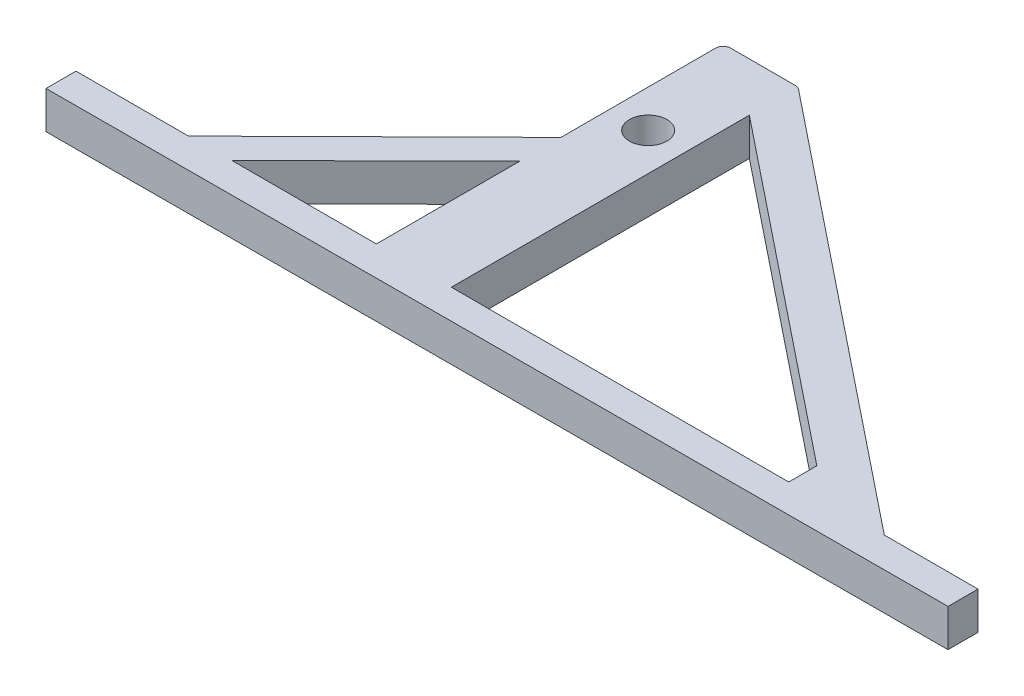
ISO-10303-21;
HEADER;
FILE_DESCRIPTION(('STEP AP214'),'2;1');
FILE_NAME('part.step','',(''),(''),'','','');
FILE_SCHEMA(('AUTOMOTIVE_DESIGN { 1 0 10303 214 1 1 1 1 }'));
ENDSEC;
DATA;
#1=APPLICATION_CONTEXT('core data for automotive mechanical design processes');
#2=APPLICATION_PROTOCOL_DEFINITION('international standard','automotive_design',2000,#1);
#3=PRODUCT_CONTEXT('',#1,'mechanical');
#4=PRODUCT('Part','Part','',(#3));
#5=PRODUCT_RELATED_PRODUCT_CATEGORY('part','',(#4));
#6=PRODUCT_DEFINITION_FORMATION('','',#4);
#7=PRODUCT_DEFINITION_CONTEXT('part definition',#1,'design');
#8=PRODUCT_DEFINITION('design','',#6,#7);
#9=PRODUCT_DEFINITION_SHAPE('','',#8);
#10=(LENGTH_UNIT() NAMED_UNIT(*) SI_UNIT(.MILLI.,.METRE.));
#11=(NAMED_UNIT(*) PLANE_ANGLE_UNIT() SI_UNIT($,.RADIAN.));
#12=(NAMED_UNIT(*) SI_UNIT($,.STERADIAN.) SOLID_ANGLE_UNIT());
#13=UNCERTAINTY_MEASURE_WITH_UNIT(LENGTH_MEASURE(1.E-05),#10,'distance_accuracy_value','');
#14=(GEOMETRIC_REPRESENTATION_CONTEXT(3) GLOBAL_UNCERTAINTY_ASSIGNED_CONTEXT((#13)) GLOBAL_UNIT_ASSIGNED_CONTEXT((#10,
#11,#12)) REPRESENTATION_CONTEXT('',''));
#15=CARTESIAN_POINT('',(0.,0.,0.));
#16=DIRECTION('',(0.,0.,1.));
#17=DIRECTION('',(1.,0.,0.));
#18=AXIS2_PLACEMENT_3D('',#15,#16,#17);
#19=CARTESIAN_POINT('',(24.5090161092301,12.7,-124.46));
#20=DIRECTION('',(0.,1.,0.));
#21=DIRECTION('',(0.,0.,1.));
#22=AXIS2_PLACEMENT_3D('',#19,#20,#21);
#23=PLANE('',#22);
#24=CARTESIAN_POINT('',(24.5090161092301,12.7,-124.46));
#25=DIRECTION('',(0.,1.,0.));
#26=DIRECTION('',(0.,0.,1.));
#27=AXIS2_PLACEMENT_3D('',#24,#25,#26);
#28=CIRCLE('',#27,2.54);
#29=CARTESIAN_POINT('',(26.0957415300184,12.7,-126.443406775985));
#30=VERTEX_POINT('',#29);
#31=CARTESIAN_POINT('',(24.5090161092301,12.7,-127.));
#32=VERTEX_POINT('',#31);
#33=EDGE_CURVE('E233',#30,#32,#28,.T.);
#34=ORIENTED_EDGE('',*,*,#33,.T.);
#35=DIRECTION('',(-1.,0.,0.));
#36=VECTOR('',#35,1.);
#37=CARTESIAN_POINT('',(2.54000000000002,12.7,-127.));
#38=LINE('',#37,#36);
#39=CARTESIAN_POINT('',(2.54,12.7,-127.));
#40=VERTEX_POINT('',#39);
#41=EDGE_CURVE('E236',#32,#40,#38,.T.);
#42=ORIENTED_EDGE('',*,*,#41,.T.);
#43=CARTESIAN_POINT('',(2.54,12.7,-124.46));
#44=DIRECTION('',(0.,1.,0.));
#45=DIRECTION('',(0.,0.,-1.));
#46=AXIS2_PLACEMENT_3D('',#43,#44,#45);
#47=CIRCLE('',#46,2.54);
#48=CARTESIAN_POINT('',(0.,12.7,-124.46));
#49=VERTEX_POINT('',#48);
#50=EDGE_CURVE('E239',#40,#49,#47,.T.);
#51=ORIENTED_EDGE('',*,*,#50,.T.);
#52=DIRECTION('',(0.,0.,1.));
#53=VECTOR('',#52,1.);
#54=CARTESIAN_POINT('',(0.,12.7,-72.0550274791085));
#55=LINE('',#54,#53);
#56=CARTESIAN_POINT('',(0.,12.7,-72.0550274791085));
#57=VERTEX_POINT('',#56);
#58=EDGE_CURVE('E241',#49,#57,#55,.T.);
#59=ORIENTED_EDGE('',*,*,#58,.T.);
#60=DIRECTION('',(-0.711451027338555,0.,0.702735679824865));
#61=VECTOR('',#60,1.);
#62=CARTESIAN_POINT('',(-63.5,12.7,-9.33290894368325));
#63=LINE('',#62,#61);
#64=CARTESIAN_POINT('',(-63.5,12.7,-9.33290894368325));
#65=VERTEX_POINT('',#64);
#66=EDGE_CURVE('E243',#57,#65,#63,.T.);
#67=ORIENTED_EDGE('',*,*,#66,.T.);
#68=DIRECTION('',(-1.,0.,0.));
#69=VECTOR('',#68,1.);
#70=CARTESIAN_POINT('',(-63.5,12.7,-9.33290894368325));
#71=LINE('',#70,#69);
#72=CARTESIAN_POINT('',(-101.6,12.7,-9.33290894368324));
#73=VERTEX_POINT('',#72);
#74=EDGE_CURVE('E245',#65,#73,#71,.T.);
#75=ORIENTED_EDGE('',*,*,#74,.T.);
#76=DIRECTION('',(0.,0.,1.));
#77=VECTOR('',#76,1.);
#78=CARTESIAN_POINT('',(-101.6,12.7,-9.33290894368324));
#79=LINE('',#78,#77);
#80=CARTESIAN_POINT('',(-101.6,12.7,0.827091056316761));
#81=VERTEX_POINT('',#80);
#82=EDGE_CURVE('E247',#73,#81,#79,.T.);
#83=ORIENTED_EDGE('',*,*,#82,.T.);
#84=DIRECTION('',(0.999996318334483,0.,-0.00271354334397683));
#85=VECTOR('',#84,1.);
#86=CARTESIAN_POINT('',(-101.6,12.7,0.827091056316761));
#87=LINE('',#86,#85);
#88=CARTESIAN_POINT('',(203.2,12.7,0.));
#89=VERTEX_POINT('',#88);
#90=EDGE_CURVE('E249',#81,#89,#87,.T.);
#91=ORIENTED_EDGE('',*,*,#90,.T.);
#92=DIRECTION('',(0.,0.,-1.));
#93=VECTOR('',#92,1.);
#94=CARTESIAN_POINT('',(203.2,12.7,0.));
#95=LINE('',#94,#93);
#96=CARTESIAN_POINT('',(203.2,12.7,-10.16));
#97=VERTEX_POINT('',#96);
#98=EDGE_CURVE('E251',#89,#97,#95,.T.);
#99=ORIENTED_EDGE('',*,*,#98,.T.);
#100=DIRECTION('',(-1.,0.,0.));
#101=VECTOR('',#100,1.);
#102=CARTESIAN_POINT('',(203.2,12.7,-10.16));
#103=LINE('',#102,#101);
#104=CARTESIAN_POINT('',(171.45,12.7,-10.16));
#105=VERTEX_POINT('',#104);
#106=EDGE_CURVE('E253',#97,#105,#103,.T.);
#107=ORIENTED_EDGE('',*,*,#106,.T.);
#108=DIRECTION('',(-0.78086880944303,0.,-0.624695047554424));
#109=VECTOR('',#108,1.);
#110=CARTESIAN_POINT('',(171.45,12.7,-10.16));
#111=LINE('',#110,#109);
#112=EDGE_CURVE('E255',#105,#30,#111,.T.);
#113=ORIENTED_EDGE('',*,*,#112,.T.);
#114=EDGE_LOOP('',(#34,#42,#51,#59,#67,#75,#83,#91,#99,#107,#113));
#115=FACE_BOUND('',#114,.T.);
#116=CARTESIAN_POINT('',(12.7,12.7,-88.9));
#117=DIRECTION('',(0.,1.,0.));
#118=DIRECTION('',(0.,0.,1.));
#119=AXIS2_PLACEMENT_3D('',#116,#117,#118);
#120=CIRCLE('',#119,6.35);
#121=CARTESIAN_POINT('',(12.7,12.7,-95.25));
#122=VERTEX_POINT('',#121);
#123=EDGE_CURVE('E227',#122,#122,#120,.T.);
#124=ORIENTED_EDGE('',*,*,#123,.F.);
#125=EDGE_LOOP('',(#124));
#126=FACE_BOUND('',#125,.T.);
#127=DIRECTION('',(0.,0.,-1.));
#128=VECTOR('',#127,1.);
#129=CARTESIAN_POINT('',(0.,12.7,-9.52499999999999));
#130=LINE('',#129,#128);
#131=CARTESIAN_POINT('',(0.,12.7,-9.52499999999999));
#132=VERTEX_POINT('',#131);
#133=CARTESIAN_POINT('',(0.,12.7,-58.0850274791085));
#134=VERTEX_POINT('',#133);
#135=EDGE_CURVE('E205',#132,#134,#130,.T.);
#136=ORIENTED_EDGE('',*,*,#135,.F.);
#137=DIRECTION('',(1.,0.,0.));
#138=VECTOR('',#137,1.);
#139=CARTESIAN_POINT('',(0.,12.7,-9.52499999999999));
#140=LINE('',#139,#138);
#141=CARTESIAN_POINT('',(-48.9620011163881,12.7,-9.52499999999999));
#142=VERTEX_POINT('',#141);
#143=EDGE_CURVE('E203',#142,#132,#140,.T.);
#144=ORIENTED_EDGE('',*,*,#143,.F.);
#145=DIRECTION('',(-0.710015355632729,0.,0.70418619325128));
#146=VECTOR('',#145,1.);
#147=CARTESIAN_POINT('',(-48.9620011163881,12.7,-9.52499999999999));
#148=LINE('',#147,#146);
#149=EDGE_CURVE('E209',#134,#142,#148,.T.);
#150=ORIENTED_EDGE('',*,*,#149,.F.);
#151=EDGE_LOOP('',(#136,#144,#150));
#152=FACE_BOUND('',#151,.T.);
#153=DIRECTION('',(0.,0.,1.));
#154=VECTOR('',#153,1.);
#155=CARTESIAN_POINT('',(25.4,12.7,-9.52499999999999));
#156=LINE('',#155,#154);
#157=CARTESIAN_POINT('',(25.4,12.7,-110.49));
#158=VERTEX_POINT('',#157);
#159=CARTESIAN_POINT('',(25.4,12.7,-9.52499999999999));
#160=VERTEX_POINT('',#159);
#161=EDGE_CURVE('E175',#158,#160,#156,.T.);
#162=ORIENTED_EDGE('',*,*,#161,.F.);
#163=DIRECTION('',(-0.78086880944303,0.,-0.624695047554424));
#164=VECTOR('',#163,1.);
#165=CARTESIAN_POINT('',(139.7,12.7,-19.05));
#166=LINE('',#165,#164);
#167=CARTESIAN_POINT('',(139.7,12.7,-19.05));
#168=VERTEX_POINT('',#167);
#169=EDGE_CURVE('E167',#168,#158,#166,.T.);
#170=ORIENTED_EDGE('',*,*,#169,.F.);
#171=DIRECTION('',(0.,0.,-1.));
#172=VECTOR('',#171,1.);
#173=CARTESIAN_POINT('',(139.7,12.7,-9.525));
#174=LINE('',#173,#172);
#175=CARTESIAN_POINT('',(139.7,12.7,-9.52499999999999));
#176=VERTEX_POINT('',#175);
#177=EDGE_CURVE('E189',#176,#168,#174,.T.);
#178=ORIENTED_EDGE('',*,*,#177,.F.);
#179=DIRECTION('',(1.,0.,0.));
#180=VECTOR('',#179,1.);
#181=CARTESIAN_POINT('',(139.7,12.7,-9.525));
#182=LINE('',#181,#180);
#183=EDGE_CURVE('E187',#160,#176,#182,.T.);
#184=ORIENTED_EDGE('',*,*,#183,.F.);
#185=EDGE_LOOP('',(#162,#170,#178,#184));
#186=FACE_BOUND('',#185,.T.);
#187=ADVANCED_FACE('F42',(#115,#126,#152,#186),#23,.T.);
#188=CARTESIAN_POINT('',(24.5090161092301,0.,-124.46));
#189=DIRECTION('',(0.,1.,0.));
#190=DIRECTION('',(0.,0.,1.));
#191=AXIS2_PLACEMENT_3D('',#188,#189,#190);
#192=PLANE('',#191);
#193=DIRECTION('',(1.,0.,0.));
#194=VECTOR('',#193,1.);
#195=CARTESIAN_POINT('',(0.,0.,-9.52499999999999));
#196=LINE('',#195,#194);
#197=CARTESIAN_POINT('',(-48.9620011163881,0.,-9.52499999999998));
#198=VERTEX_POINT('',#197);
#199=CARTESIAN_POINT('',(0.,0.,-9.52499999999999));
#200=VERTEX_POINT('',#199);
#201=EDGE_CURVE('E183',#198,#200,#196,.T.);
#202=ORIENTED_EDGE('',*,*,#201,.T.);
#203=DIRECTION('',(0.,0.,-1.));
#204=VECTOR('',#203,1.);
#205=CARTESIAN_POINT('',(0.,0.,-9.52499999999999));
#206=LINE('',#205,#204);
#207=CARTESIAN_POINT('',(0.,0.,-58.0850274791085));
#208=VERTEX_POINT('',#207);
#209=EDGE_CURVE('E214',#200,#208,#206,.T.);
#210=ORIENTED_EDGE('',*,*,#209,.T.);
#211=DIRECTION('',(-0.710015355632729,0.,0.70418619325128));
#212=VECTOR('',#211,1.);
#213=CARTESIAN_POINT('',(-48.9620011163881,0.,-9.52499999999999));
#214=LINE('',#213,#212);
#215=EDGE_CURVE('E206',#208,#198,#214,.T.);
#216=ORIENTED_EDGE('',*,*,#215,.T.);
#217=EDGE_LOOP('',(#202,#210,#216));
#218=FACE_BOUND('',#217,.T.);
#219=CARTESIAN_POINT('',(24.5090161092301,0.,-124.46));
#220=DIRECTION('',(0.,1.,0.));
#221=DIRECTION('',(0.,0.,1.));
#222=AXIS2_PLACEMENT_3D('',#219,#220,#221);
#223=CIRCLE('',#222,2.54);
#224=CARTESIAN_POINT('',(26.0957415300184,0.,-126.443406775985));
#225=VERTEX_POINT('',#224);
#226=CARTESIAN_POINT('',(24.5090161092301,0.,-127.));
#227=VERTEX_POINT('',#226);
#228=EDGE_CURVE('E230',#225,#227,#223,.T.);
#229=ORIENTED_EDGE('',*,*,#228,.F.);
#230=DIRECTION('',(-0.78086880944303,0.,-0.624695047554424));
#231=VECTOR('',#230,1.);
#232=CARTESIAN_POINT('',(171.45,0.,-10.16));
#233=LINE('',#232,#231);
#234=CARTESIAN_POINT('',(171.45,0.,-10.16));
#235=VERTEX_POINT('',#234);
#236=EDGE_CURVE('E237',#235,#225,#233,.T.);
#237=ORIENTED_EDGE('',*,*,#236,.F.);
#238=DIRECTION('',(-1.,0.,0.));
#239=VECTOR('',#238,1.);
#240=CARTESIAN_POINT('',(203.2,0.,-10.16));
#241=LINE('',#240,#239);
#242=CARTESIAN_POINT('',(203.2,0.,-10.16));
#243=VERTEX_POINT('',#242);
#244=EDGE_CURVE('E276',#243,#235,#241,.T.);
#245=ORIENTED_EDGE('',*,*,#244,.F.);
#246=DIRECTION('',(0.,0.,-1.));
#247=VECTOR('',#246,1.);
#248=CARTESIAN_POINT('',(203.2,0.,0.));
#249=LINE('',#248,#247);
#250=CARTESIAN_POINT('',(203.2,0.,0.));
#251=VERTEX_POINT('',#250);
#252=EDGE_CURVE('E274',#251,#243,#249,.T.);
#253=ORIENTED_EDGE('',*,*,#252,.F.);
#254=DIRECTION('',(0.999996318334483,0.,-0.00271354334397683));
#255=VECTOR('',#254,1.);
#256=CARTESIAN_POINT('',(-101.6,0.,0.827091056316761));
#257=LINE('',#256,#255);
#258=CARTESIAN_POINT('',(-101.6,0.,0.827091056316761));
#259=VERTEX_POINT('',#258);
#260=EDGE_CURVE('E272',#259,#251,#257,.T.);
#261=ORIENTED_EDGE('',*,*,#260,.F.);
#262=DIRECTION('',(0.,0.,1.));
#263=VECTOR('',#262,1.);
#264=CARTESIAN_POINT('',(-101.6,0.,-9.33290894368324));
#265=LINE('',#264,#263);
#266=CARTESIAN_POINT('',(-101.6,0.,-9.33290894368324));
#267=VERTEX_POINT('',#266);
#268=EDGE_CURVE('E270',#267,#259,#265,.T.);
#269=ORIENTED_EDGE('',*,*,#268,.F.);
#270=DIRECTION('',(-1.,0.,0.));
#271=VECTOR('',#270,1.);
#272=CARTESIAN_POINT('',(-63.5,0.,-9.33290894368325));
#273=LINE('',#272,#271);
#274=CARTESIAN_POINT('',(-63.5,0.,-9.33290894368325));
#275=VERTEX_POINT('',#274);
#276=EDGE_CURVE('E268',#275,#267,#273,.T.);
#277=ORIENTED_EDGE('',*,*,#276,.F.);
#278=DIRECTION('',(-0.711451027338555,0.,0.702735679824865));
#279=VECTOR('',#278,1.);
#280=CARTESIAN_POINT('',(-63.5,0.,-9.33290894368325));
#281=LINE('',#280,#279);
#282=CARTESIAN_POINT('',(0.,0.,-72.0550274791085));
#283=VERTEX_POINT('',#282);
#284=EDGE_CURVE('E266',#283,#275,#281,.T.);
#285=ORIENTED_EDGE('',*,*,#284,.F.);
#286=DIRECTION('',(0.,0.,1.));
#287=VECTOR('',#286,1.);
#288=CARTESIAN_POINT('',(0.,0.,-72.0550274791085));
#289=LINE('',#288,#287);
#290=CARTESIAN_POINT('',(0.,0.,-124.46));
#291=VERTEX_POINT('',#290);
#292=EDGE_CURVE('E264',#291,#283,#289,.T.);
#293=ORIENTED_EDGE('',*,*,#292,.F.);
#294=CARTESIAN_POINT('',(2.54,0.,-124.46));
#295=DIRECTION('',(0.,1.,0.));
#296=DIRECTION('',(0.,0.,-1.));
#297=AXIS2_PLACEMENT_3D('',#294,#295,#296);
#298=CIRCLE('',#297,2.54);
#299=CARTESIAN_POINT('',(2.54,0.,-127.));
#300=VERTEX_POINT('',#299);
#301=EDGE_CURVE('E262',#300,#291,#298,.T.);
#302=ORIENTED_EDGE('',*,*,#301,.F.);
#303=DIRECTION('',(-1.,0.,0.));
#304=VECTOR('',#303,1.);
#305=CARTESIAN_POINT('',(2.54000000000002,0.,-127.));
#306=LINE('',#305,#304);
#307=EDGE_CURVE('E260',#227,#300,#306,.T.);
#308=ORIENTED_EDGE('',*,*,#307,.F.);
#309=EDGE_LOOP('',(#229,#237,#245,#253,#261,#269,#277,#285,#293,#302,#308));
#310=FACE_BOUND('',#309,.T.);
#311=CARTESIAN_POINT('',(12.7,0.,-88.9));
#312=DIRECTION('',(0.,1.,0.));
#313=DIRECTION('',(0.,0.,1.));
#314=AXIS2_PLACEMENT_3D('',#311,#312,#313);
#315=CIRCLE('',#314,6.35);
#316=CARTESIAN_POINT('',(12.7,0.,-95.25));
#317=VERTEX_POINT('',#316);
#318=EDGE_CURVE('E226',#317,#317,#315,.T.);
#319=ORIENTED_EDGE('',*,*,#318,.T.);
#320=EDGE_LOOP('',(#319));
#321=FACE_BOUND('',#320,.T.);
#322=DIRECTION('',(-0.78086880944303,0.,-0.624695047554424));
#323=VECTOR('',#322,1.);
#324=CARTESIAN_POINT('',(139.7,0.,-19.05));
#325=LINE('',#324,#323);
#326=CARTESIAN_POINT('',(139.7,0.,-19.05));
#327=VERTEX_POINT('',#326);
#328=CARTESIAN_POINT('',(25.4,0.,-110.49));
#329=VERTEX_POINT('',#328);
#330=EDGE_CURVE('E65',#327,#329,#325,.T.);
#331=ORIENTED_EDGE('',*,*,#330,.T.);
#332=DIRECTION('',(0.,0.,1.));
#333=VECTOR('',#332,1.);
#334=CARTESIAN_POINT('',(25.4,0.,-9.52499999999999));
#335=LINE('',#334,#333);
#336=CARTESIAN_POINT('',(25.4,0.,-9.52499999999999));
#337=VERTEX_POINT('',#336);
#338=EDGE_CURVE('E182',#329,#337,#335,.T.);
#339=ORIENTED_EDGE('',*,*,#338,.T.);
#340=DIRECTION('',(1.,0.,0.));
#341=VECTOR('',#340,1.);
#342=CARTESIAN_POINT('',(139.7,0.,-9.525));
#343=LINE('',#342,#341);
#344=CARTESIAN_POINT('',(139.7,0.,-9.525));
#345=VERTEX_POINT('',#344);
#346=EDGE_CURVE('E195',#337,#345,#343,.T.);
#347=ORIENTED_EDGE('',*,*,#346,.T.);
#348=DIRECTION('',(0.,0.,-1.));
#349=VECTOR('',#348,1.);
#350=CARTESIAN_POINT('',(139.7,0.,-9.525));
#351=LINE('',#350,#349);
#352=EDGE_CURVE('E176',#345,#327,#351,.T.);
#353=ORIENTED_EDGE('',*,*,#352,.T.);
#354=EDGE_LOOP('',(#331,#339,#347,#353));
#355=FACE_BOUND('',#354,.T.);
#356=ADVANCED_FACE('F315',(#218,#310,#321,#355),#192,.F.);
#357=CARTESIAN_POINT('',(24.5090161092301,12.7,-124.46));
#358=DIRECTION('',(0.,-1.,0.));
#359=DIRECTION('',(0.,0.,-1.));
#360=AXIS2_PLACEMENT_3D('',#357,#358,#359);
#361=CYLINDRICAL_SURFACE('',#360,2.54);
#362=ORIENTED_EDGE('',*,*,#228,.T.);
#363=DIRECTION('',(0.,-1.,0.));
#364=VECTOR('',#363,1.);
#365=CARTESIAN_POINT('',(24.5090161092301,12.7,-127.));
#366=LINE('',#365,#364);
#367=EDGE_CURVE('E13',#32,#227,#366,.T.);
#368=ORIENTED_EDGE('',*,*,#367,.F.);
#369=ORIENTED_EDGE('',*,*,#33,.F.);
#370=DIRECTION('',(0.,-1.,0.));
#371=VECTOR('',#370,1.);
#372=CARTESIAN_POINT('',(26.0957415300184,12.7,-126.443406775985));
#373=LINE('',#372,#371);
#374=EDGE_CURVE('E257',#30,#225,#373,.T.);
#375=ORIENTED_EDGE('',*,*,#374,.T.);
#376=EDGE_LOOP('',(#362,#368,#369,#375));
#377=FACE_BOUND('',#376,.T.);
#378=ADVANCED_FACE('F44',(#377),#361,.T.);
#379=CARTESIAN_POINT('',(2.54000000000002,12.7,-127.));
#380=DIRECTION('',(0.,0.,1.));
#381=DIRECTION('',(1.,0.,0.));
#382=AXIS2_PLACEMENT_3D('',#379,#380,#381);
#383=PLANE('',#382);
#384=ORIENTED_EDGE('',*,*,#307,.T.);
#385=DIRECTION('',(0.,-1.,0.));
#386=VECTOR('',#385,1.);
#387=CARTESIAN_POINT('',(2.54,12.7,-127.));
#388=LINE('',#387,#386);
#389=EDGE_CURVE('E50',#40,#300,#388,.T.);
#390=ORIENTED_EDGE('',*,*,#389,.F.);
#391=ORIENTED_EDGE('',*,*,#41,.F.);
#392=ORIENTED_EDGE('',*,*,#367,.T.);
#393=EDGE_LOOP('',(#384,#390,#391,#392));
#394=FACE_BOUND('',#393,.T.);
#395=ADVANCED_FACE('F333',(#394),#383,.F.);
#396=CARTESIAN_POINT('',(2.54,12.7,-124.46));
#397=DIRECTION('',(0.,-1.,0.));
#398=DIRECTION('',(0.,0.,-1.));
#399=AXIS2_PLACEMENT_3D('',#396,#397,#398);
#400=CYLINDRICAL_SURFACE('',#399,2.54);
#401=ORIENTED_EDGE('',*,*,#301,.T.);
#402=DIRECTION('',(0.,-1.,0.));
#403=VECTOR('',#402,1.);
#404=CARTESIAN_POINT('',(0.,12.7,-124.46));
#405=LINE('',#404,#403);
#406=EDGE_CURVE('E302',#49,#291,#405,.T.);
#407=ORIENTED_EDGE('',*,*,#406,.F.);
#408=ORIENTED_EDGE('',*,*,#50,.F.);
#409=ORIENTED_EDGE('',*,*,#389,.T.);
#410=EDGE_LOOP('',(#401,#407,#408,#409));
#411=FACE_BOUND('',#410,.T.);
#412=ADVANCED_FACE('F309',(#411),#400,.T.);
#413=CARTESIAN_POINT('',(0.,12.7,-72.0550274791085));
#414=DIRECTION('',(1.,0.,0.));
#415=DIRECTION('',(0.,0.,-1.));
#416=AXIS2_PLACEMENT_3D('',#413,#414,#415);
#417=PLANE('',#416);
#418=ORIENTED_EDGE('',*,*,#292,.T.);
#419=DIRECTION('',(0.,-1.,0.));
#420=VECTOR('',#419,1.);
#421=CARTESIAN_POINT('',(0.,12.7,-72.0550274791085));
#422=LINE('',#421,#420);
#423=EDGE_CURVE('E299',#57,#283,#422,.T.);
#424=ORIENTED_EDGE('',*,*,#423,.F.);
#425=ORIENTED_EDGE('',*,*,#58,.F.);
#426=ORIENTED_EDGE('',*,*,#406,.T.);
#427=EDGE_LOOP('',(#418,#424,#425,#426));
#428=FACE_BOUND('',#427,.T.);
#429=ADVANCED_FACE('F321',(#428),#417,.F.);
#430=CARTESIAN_POINT('',(-63.5,12.7,-9.33290894368325));
#431=DIRECTION('',(0.702735679824865,0.,0.711451027338555));
#432=DIRECTION('',(0.711451027338555,0.,-0.702735679824865));
#433=AXIS2_PLACEMENT_3D('',#430,#431,#432);
#434=PLANE('',#433);
#435=ORIENTED_EDGE('',*,*,#284,.T.);
#436=DIRECTION('',(0.,-1.,0.));
#437=VECTOR('',#436,1.);
#438=CARTESIAN_POINT('',(-63.5,12.7,-9.33290894368325));
#439=LINE('',#438,#437);
#440=EDGE_CURVE('E296',#65,#275,#439,.T.);
#441=ORIENTED_EDGE('',*,*,#440,.F.);
#442=ORIENTED_EDGE('',*,*,#66,.F.);
#443=ORIENTED_EDGE('',*,*,#423,.T.);
#444=EDGE_LOOP('',(#435,#441,#442,#443));
#445=FACE_BOUND('',#444,.T.);
#446=ADVANCED_FACE('F325',(#445),#434,.F.);
#447=CARTESIAN_POINT('',(-63.5,12.7,-9.33290894368325));
#448=DIRECTION('',(0.,0.,1.));
#449=DIRECTION('',(1.,0.,0.));
#450=AXIS2_PLACEMENT_3D('',#447,#448,#449);
#451=PLANE('',#450);
#452=ORIENTED_EDGE('',*,*,#276,.T.);
#453=DIRECTION('',(0.,-1.,0.));
#454=VECTOR('',#453,1.);
#455=CARTESIAN_POINT('',(-101.6,12.7,-9.33290894368324));
#456=LINE('',#455,#454);
#457=EDGE_CURVE('E293',#73,#267,#456,.T.);
#458=ORIENTED_EDGE('',*,*,#457,.F.);
#459=ORIENTED_EDGE('',*,*,#74,.F.);
#460=ORIENTED_EDGE('',*,*,#440,.T.);
#461=EDGE_LOOP('',(#452,#458,#459,#460));
#462=FACE_BOUND('',#461,.T.);
#463=ADVANCED_FACE('F361',(#462),#451,.F.);
#464=CARTESIAN_POINT('',(-101.6,12.7,-9.33290894368324));
#465=DIRECTION('',(1.,0.,0.));
#466=DIRECTION('',(0.,0.,-1.));
#467=AXIS2_PLACEMENT_3D('',#464,#465,#466);
#468=PLANE('',#467);
#469=ORIENTED_EDGE('',*,*,#268,.T.);
#470=DIRECTION('',(0.,-1.,0.));
#471=VECTOR('',#470,1.);
#472=CARTESIAN_POINT('',(-101.6,12.7,0.827091056316761));
#473=LINE('',#472,#471);
#474=EDGE_CURVE('E290',#81,#259,#473,.T.);
#475=ORIENTED_EDGE('',*,*,#474,.F.);
#476=ORIENTED_EDGE('',*,*,#82,.F.);
#477=ORIENTED_EDGE('',*,*,#457,.T.);
#478=EDGE_LOOP('',(#469,#475,#476,#477));
#479=FACE_BOUND('',#478,.T.);
#480=ADVANCED_FACE('F359',(#479),#468,.F.);
#481=CARTESIAN_POINT('',(-101.6,12.7,0.827091056316761));
#482=DIRECTION('',(-0.00271354334397683,0.,-0.999996318334483));
#483=DIRECTION('',(-0.999996318334483,0.,0.00271354334397683));
#484=AXIS2_PLACEMENT_3D('',#481,#482,#483);
#485=PLANE('',#484);
#486=ORIENTED_EDGE('',*,*,#260,.T.);
#487=DIRECTION('',(0.,-1.,0.));
#488=VECTOR('',#487,1.);
#489=CARTESIAN_POINT('',(203.2,12.7,0.));
#490=LINE('',#489,#488);
#491=EDGE_CURVE('E287',#89,#251,#490,.T.);
#492=ORIENTED_EDGE('',*,*,#491,.F.);
#493=ORIENTED_EDGE('',*,*,#90,.F.);
#494=ORIENTED_EDGE('',*,*,#474,.T.);
#495=EDGE_LOOP('',(#486,#492,#493,#494));
#496=FACE_BOUND('',#495,.T.);
#497=ADVANCED_FACE('F354',(#496),#485,.F.);
#498=CARTESIAN_POINT('',(203.2,12.7,0.));
#499=DIRECTION('',(-1.,0.,0.));
#500=DIRECTION('',(0.,0.,1.));
#501=AXIS2_PLACEMENT_3D('',#498,#499,#500);
#502=PLANE('',#501);
#503=ORIENTED_EDGE('',*,*,#252,.T.);
#504=DIRECTION('',(0.,-1.,0.));
#505=VECTOR('',#504,1.);
#506=CARTESIAN_POINT('',(203.2,12.7,-10.16));
#507=LINE('',#506,#505);
#508=EDGE_CURVE('E284',#97,#243,#507,.T.);
#509=ORIENTED_EDGE('',*,*,#508,.F.);
#510=ORIENTED_EDGE('',*,*,#98,.F.);
#511=ORIENTED_EDGE('',*,*,#491,.T.);
#512=EDGE_LOOP('',(#503,#509,#510,#511));
#513=FACE_BOUND('',#512,.T.);
#514=ADVANCED_FACE('F349',(#513),#502,.F.);
#515=CARTESIAN_POINT('',(203.2,12.7,-10.16));
#516=DIRECTION('',(0.,0.,1.));
#517=DIRECTION('',(1.,0.,0.));
#518=AXIS2_PLACEMENT_3D('',#515,#516,#517);
#519=PLANE('',#518);
#520=ORIENTED_EDGE('',*,*,#244,.T.);
#521=DIRECTION('',(0.,-1.,0.));
#522=VECTOR('',#521,1.);
#523=CARTESIAN_POINT('',(171.45,12.7,-10.16));
#524=LINE('',#523,#522);
#525=EDGE_CURVE('E281',#105,#235,#524,.T.);
#526=ORIENTED_EDGE('',*,*,#525,.F.);
#527=ORIENTED_EDGE('',*,*,#106,.F.);
#528=ORIENTED_EDGE('',*,*,#508,.T.);
#529=EDGE_LOOP('',(#520,#526,#527,#528));
#530=FACE_BOUND('',#529,.T.);
#531=ADVANCED_FACE('F345',(#530),#519,.F.);
#532=CARTESIAN_POINT('',(171.45,12.7,-10.16));
#533=DIRECTION('',(-0.624695047554424,0.,0.78086880944303));
#534=DIRECTION('',(0.78086880944303,0.,0.624695047554424));
#535=AXIS2_PLACEMENT_3D('',#532,#533,#534);
#536=PLANE('',#535);
#537=ORIENTED_EDGE('',*,*,#236,.T.);
#538=ORIENTED_EDGE('',*,*,#374,.F.);
#539=ORIENTED_EDGE('',*,*,#112,.F.);
#540=ORIENTED_EDGE('',*,*,#525,.T.);
#541=EDGE_LOOP('',(#537,#538,#539,#540));
#542=FACE_BOUND('',#541,.T.);
#543=ADVANCED_FACE('F340',(#542),#536,.F.);
#544=CARTESIAN_POINT('',(12.7,12.7,-88.9));
#545=DIRECTION('',(0.,-1.,0.));
#546=DIRECTION('',(0.,0.,-1.));
#547=AXIS2_PLACEMENT_3D('',#544,#545,#546);
#548=CYLINDRICAL_SURFACE('',#547,6.35);
#549=CARTESIAN_POINT('',(12.7,12.7,-95.25));
#550=CARTESIAN_POINT('',(12.7,12.5677083333333,-95.25));
#551=CARTESIAN_POINT('',(12.7,12.4354166666667,-95.25));
#552=CARTESIAN_POINT('',(12.7,12.1708333333333,-95.25));
#553=CARTESIAN_POINT('',(12.7,12.0385416666667,-95.25));
#554=CARTESIAN_POINT('',(12.7,11.7739583333333,-95.25));
#555=CARTESIAN_POINT('',(12.7,11.6416666666667,-95.25));
#556=CARTESIAN_POINT('',(12.7,11.3770833333333,-95.25));
#557=CARTESIAN_POINT('',(12.7,11.2447916666667,-95.25));
#558=CARTESIAN_POINT('',(12.7,10.9802083333333,-95.25));
#559=CARTESIAN_POINT('',(12.7,10.8479166666667,-95.25));
#560=CARTESIAN_POINT('',(12.7,10.5833333333333,-95.25));
#561=CARTESIAN_POINT('',(12.7,10.4510416666667,-95.25));
#562=CARTESIAN_POINT('',(12.7,10.1864583333333,-95.25));
#563=CARTESIAN_POINT('',(12.7,10.0541666666667,-95.25));
#564=CARTESIAN_POINT('',(12.7,9.78958333333333,-95.25));
#565=CARTESIAN_POINT('',(12.7,9.65729166666667,-95.25));
#566=CARTESIAN_POINT('',(12.7,9.39270833333333,-95.25));
#567=CARTESIAN_POINT('',(12.7,9.26041666666667,-95.25));
#568=CARTESIAN_POINT('',(12.7,8.99583333333333,-95.25));
#569=CARTESIAN_POINT('',(12.7,8.86354166666667,-95.25));
#570=CARTESIAN_POINT('',(12.7,8.59895833333333,-95.25));
#571=CARTESIAN_POINT('',(12.7,8.46666666666667,-95.25));
#572=CARTESIAN_POINT('',(12.7,8.20208333333333,-95.25));
#573=CARTESIAN_POINT('',(12.7,8.06979166666667,-95.25));
#574=CARTESIAN_POINT('',(12.7,7.80520833333333,-95.25));
#575=CARTESIAN_POINT('',(12.7,7.67291666666667,-95.25));
#576=CARTESIAN_POINT('',(12.7,7.40833333333333,-95.25));
#577=CARTESIAN_POINT('',(12.7,7.27604166666667,-95.25));
#578=CARTESIAN_POINT('',(12.7,7.01145833333333,-95.25));
#579=CARTESIAN_POINT('',(12.7,6.87916666666667,-95.25));
#580=CARTESIAN_POINT('',(12.7,6.61458333333333,-95.25));
#581=CARTESIAN_POINT('',(12.7,6.48229166666667,-95.25));
#582=CARTESIAN_POINT('',(12.7,6.21770833333333,-95.25));
#583=CARTESIAN_POINT('',(12.7,6.08541666666667,-95.25));
#584=CARTESIAN_POINT('',(12.7,5.82083333333333,-95.25));
#585=CARTESIAN_POINT('',(12.7,5.68854166666667,-95.25));
#586=CARTESIAN_POINT('',(12.7,5.42395833333333,-95.25));
#587=CARTESIAN_POINT('',(12.7,5.29166666666667,-95.25));
#588=CARTESIAN_POINT('',(12.7,5.02708333333333,-95.25));
#589=CARTESIAN_POINT('',(12.7,4.89479166666667,-95.25));
#590=CARTESIAN_POINT('',(12.7,4.63020833333333,-95.25));
#591=CARTESIAN_POINT('',(12.7,4.49791666666667,-95.25));
#592=CARTESIAN_POINT('',(12.7,4.23333333333333,-95.25));
#593=CARTESIAN_POINT('',(12.7,4.10104166666667,-95.25));
#594=CARTESIAN_POINT('',(12.7,3.83645833333333,-95.25));
#595=CARTESIAN_POINT('',(12.7,3.70416666666667,-95.25));
#596=CARTESIAN_POINT('',(12.7,3.43958333333333,-95.25));
#597=CARTESIAN_POINT('',(12.7,3.30729166666667,-95.25));
#598=CARTESIAN_POINT('',(12.7,3.04270833333333,-95.25));
#599=CARTESIAN_POINT('',(12.7,2.91041666666667,-95.25));
#600=CARTESIAN_POINT('',(12.7,2.64583333333333,-95.25));
#601=CARTESIAN_POINT('',(12.7,2.51354166666667,-95.25));
#602=CARTESIAN_POINT('',(12.7,2.24895833333333,-95.25));
#603=CARTESIAN_POINT('',(12.7,2.11666666666667,-95.25));
#604=CARTESIAN_POINT('',(12.7,1.85208333333333,-95.25));
#605=CARTESIAN_POINT('',(12.7,1.71979166666667,-95.25));
#606=CARTESIAN_POINT('',(12.7,1.45520833333333,-95.25));
#607=CARTESIAN_POINT('',(12.7,1.32291666666667,-95.25));
#608=CARTESIAN_POINT('',(12.7,1.05833333333333,-95.25));
#609=CARTESIAN_POINT('',(12.7,0.926041666666666,-95.25));
#610=CARTESIAN_POINT('',(12.7,0.661458333333333,-95.25));
#611=CARTESIAN_POINT('',(12.7,0.529166666666666,-95.25));
#612=CARTESIAN_POINT('',(12.7,0.264583333333333,-95.25));
#613=CARTESIAN_POINT('',(12.7,0.132291666666667,-95.25));
#614=CARTESIAN_POINT('',(12.7,0.,-95.25));
#615=B_SPLINE_CURVE_WITH_KNOTS('',3,(#549,#550,#551,#552,#553,#554,#555,#556,#557,#558,#559,
#560,#561,#562,#563,#564,#565,#566,#567,#568,#569,#570,#571,#572,#573,#574,#575,#576,#577,#578,
#579,#580,#581,#582,#583,#584,#585,#586,#587,#588,#589,#590,#591,#592,#593,#594,#595,#596,#597,
#598,#599,#600,#601,#602,#603,#604,#605,#606,#607,#608,#609,#610,#611,#612,#613,#614),
.UNSPECIFIED.,.F.,.F.,(4,2,2,2,2,2,2,2,2,2,2,2,2,2,2,2,2,2,2,2,2,2,2,2,2,2,2,2,2,2,2,2,4),(0.,
0.396875000000001,0.793750000000001,1.190625,1.5875,1.984375,2.38125,2.778125,3.175,3.571875,
3.96875,4.365625,4.7625,5.159375,5.55625,5.953125,6.35,6.746875,7.14375,7.540625,7.9375,
8.334375,8.73125,9.128125,9.525,9.921875,10.31875,10.715625,11.1125,11.509375,11.90625,
12.303125,12.7),.UNSPECIFIED.);
#616=EDGE_CURVE('BSEAM378',#122,#317,#615,.T.);
#617=ORIENTED_EDGE('',*,*,#123,.T.);
#618=ORIENTED_EDGE('',*,*,#318,.F.);
#619=ORIENTED_EDGE('',*,*,#616,.T.);
#620=ORIENTED_EDGE('',*,*,#616,.F.);
#621=EDGE_LOOP('',(#617,#619,#618,#620));
#622=FACE_BOUND('',#621,.T.);
#623=ADVANCED_FACE('F378',(#622),#548,.F.);
#624=CARTESIAN_POINT('',(0.,12.7,-9.52499999999999));
#625=DIRECTION('',(0.,0.,-1.));
#626=DIRECTION('',(-1.,0.,0.));
#627=AXIS2_PLACEMENT_3D('',#624,#625,#626);
#628=PLANE('',#627);
#629=ORIENTED_EDGE('',*,*,#201,.F.);
#630=DIRECTION('',(0.,-1.,0.));
#631=VECTOR('',#630,1.);
#632=CARTESIAN_POINT('',(-48.9620011163881,12.7,-9.52499999999999));
#633=LINE('',#632,#631);
#634=EDGE_CURVE('E211',#142,#198,#633,.T.);
#635=ORIENTED_EDGE('',*,*,#634,.F.);
#636=ORIENTED_EDGE('',*,*,#143,.T.);
#637=DIRECTION('',(0.,-1.,0.));
#638=VECTOR('',#637,1.);
#639=CARTESIAN_POINT('',(0.,12.7,-9.52499999999999));
#640=LINE('',#639,#638);
#641=EDGE_CURVE('E223',#132,#200,#640,.T.);
#642=ORIENTED_EDGE('',*,*,#641,.T.);
#643=EDGE_LOOP('',(#629,#635,#636,#642));
#644=FACE_BOUND('',#643,.T.);
#645=ADVANCED_FACE('F410',(#644),#628,.T.);
#646=CARTESIAN_POINT('',(0.,12.7,-9.52499999999999));
#647=DIRECTION('',(-1.,0.,0.));
#648=DIRECTION('',(0.,0.,1.));
#649=AXIS2_PLACEMENT_3D('',#646,#647,#648);
#650=PLANE('',#649);
#651=ORIENTED_EDGE('',*,*,#209,.F.);
#652=ORIENTED_EDGE('',*,*,#641,.F.);
#653=ORIENTED_EDGE('',*,*,#135,.T.);
#654=DIRECTION('',(0.,-1.,0.));
#655=VECTOR('',#654,1.);
#656=CARTESIAN_POINT('',(0.,12.7,-58.0850274791085));
#657=LINE('',#656,#655);
#658=EDGE_CURVE('E221',#134,#208,#657,.T.);
#659=ORIENTED_EDGE('',*,*,#658,.T.);
#660=EDGE_LOOP('',(#651,#652,#653,#659));
#661=FACE_BOUND('',#660,.T.);
#662=ADVANCED_FACE('F417',(#661),#650,.T.);
#663=CARTESIAN_POINT('',(-48.9620011163881,12.7,-9.52499999999999));
#664=DIRECTION('',(0.70418619325128,0.,0.710015355632729));
#665=DIRECTION('',(0.710015355632729,0.,-0.70418619325128));
#666=AXIS2_PLACEMENT_3D('',#663,#664,#665);
#667=PLANE('',#666);
#668=ORIENTED_EDGE('',*,*,#215,.F.);
#669=ORIENTED_EDGE('',*,*,#658,.F.);
#670=ORIENTED_EDGE('',*,*,#149,.T.);
#671=ORIENTED_EDGE('',*,*,#634,.T.);
#672=EDGE_LOOP('',(#668,#669,#670,#671));
#673=FACE_BOUND('',#672,.T.);
#674=ADVANCED_FACE('F424',(#673),#667,.T.);
#675=CARTESIAN_POINT('',(139.7,12.7,-19.05));
#676=DIRECTION('',(-0.624695047554424,0.,0.78086880944303));
#677=DIRECTION('',(0.78086880944303,0.,0.624695047554424));
#678=AXIS2_PLACEMENT_3D('',#675,#676,#677);
#679=PLANE('',#678);
#680=ORIENTED_EDGE('',*,*,#330,.F.);
#681=DIRECTION('',(0.,-1.,0.));
#682=VECTOR('',#681,1.);
#683=CARTESIAN_POINT('',(139.7,12.7,-19.05));
#684=LINE('',#683,#682);
#685=EDGE_CURVE('E171',#168,#327,#684,.T.);
#686=ORIENTED_EDGE('',*,*,#685,.F.);
#687=ORIENTED_EDGE('',*,*,#169,.T.);
#688=DIRECTION('',(0.,-1.,0.));
#689=VECTOR('',#688,1.);
#690=CARTESIAN_POINT('',(25.4,12.7,-110.49));
#691=LINE('',#690,#689);
#692=EDGE_CURVE('E170',#158,#329,#691,.T.);
#693=ORIENTED_EDGE('',*,*,#692,.T.);
#694=EDGE_LOOP('',(#680,#686,#687,#693));
#695=FACE_BOUND('',#694,.T.);
#696=ADVANCED_FACE('F169',(#695),#679,.T.);
#697=CARTESIAN_POINT('',(25.4,12.7,-9.52499999999999));
#698=DIRECTION('',(1.,0.,0.));
#699=DIRECTION('',(0.,0.,-1.));
#700=AXIS2_PLACEMENT_3D('',#697,#698,#699);
#701=PLANE('',#700);
#702=ORIENTED_EDGE('',*,*,#338,.F.);
#703=ORIENTED_EDGE('',*,*,#692,.F.);
#704=ORIENTED_EDGE('',*,*,#161,.T.);
#705=DIRECTION('',(0.,-1.,0.));
#706=VECTOR('',#705,1.);
#707=CARTESIAN_POINT('',(25.4,12.7,-9.52499999999999));
#708=LINE('',#707,#706);
#709=EDGE_CURVE('E184',#160,#337,#708,.T.);
#710=ORIENTED_EDGE('',*,*,#709,.T.);
#711=EDGE_LOOP('',(#702,#703,#704,#710));
#712=FACE_BOUND('',#711,.T.);
#713=ADVANCED_FACE('F179',(#712),#701,.T.);
#714=CARTESIAN_POINT('',(139.7,12.7,-9.525));
#715=DIRECTION('',(0.,0.,-1.));
#716=DIRECTION('',(-1.,0.,0.));
#717=AXIS2_PLACEMENT_3D('',#714,#715,#716);
#718=PLANE('',#717);
#719=ORIENTED_EDGE('',*,*,#346,.F.);
#720=ORIENTED_EDGE('',*,*,#709,.F.);
#721=ORIENTED_EDGE('',*,*,#183,.T.);
#722=DIRECTION('',(0.,-1.,0.));
#723=VECTOR('',#722,1.);
#724=CARTESIAN_POINT('',(139.7,12.7,-9.525));
#725=LINE('',#724,#723);
#726=EDGE_CURVE('E57',#176,#345,#725,.T.);
#727=ORIENTED_EDGE('',*,*,#726,.T.);
#728=EDGE_LOOP('',(#719,#720,#721,#727));
#729=FACE_BOUND('',#728,.T.);
#730=ADVANCED_FACE('F445',(#729),#718,.T.);
#731=CARTESIAN_POINT('',(139.7,12.7,-9.525));
#732=DIRECTION('',(-1.,0.,0.));
#733=DIRECTION('',(0.,0.,1.));
#734=AXIS2_PLACEMENT_3D('',#731,#732,#733);
#735=PLANE('',#734);
#736=ORIENTED_EDGE('',*,*,#352,.F.);
#737=ORIENTED_EDGE('',*,*,#726,.F.);
#738=ORIENTED_EDGE('',*,*,#177,.T.);
#739=ORIENTED_EDGE('',*,*,#685,.T.);
#740=EDGE_LOOP('',(#736,#737,#738,#739));
#741=FACE_BOUND('',#740,.T.);
#742=ADVANCED_FACE('F452',(#741),#735,.T.);
#743=CLOSED_SHELL('',(#187,#356,#378,#395,#412,#429,#446,#463,#480,#497,#514,#531,#543,#623,
#645,#662,#674,#696,#713,#730,#742));
#744=MANIFOLD_SOLID_BREP('B2',#743);
#745=ADVANCED_BREP_SHAPE_REPRESENTATION('',(#18,#744),#14);
#746=SHAPE_DEFINITION_REPRESENTATION(#9,#745);
ENDSEC;
END-ISO-10303-21;
